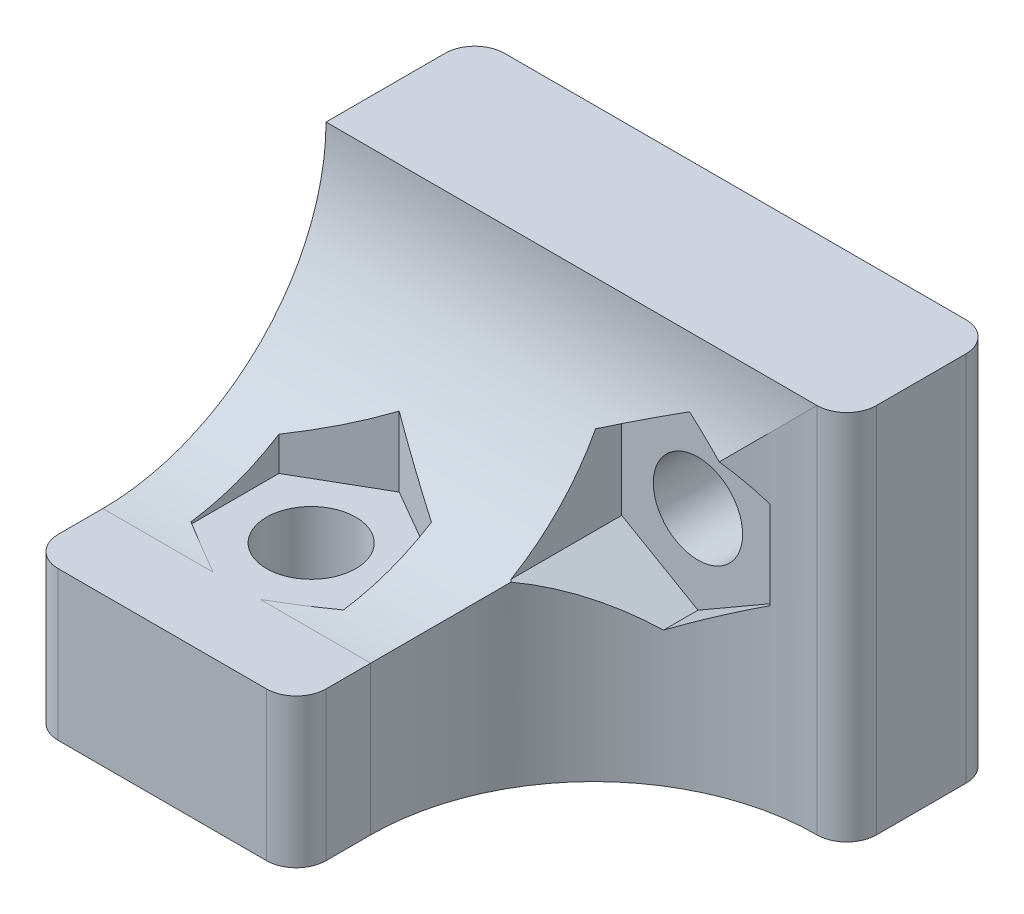
ISO-10303-21;
HEADER;
FILE_DESCRIPTION(('STEP AP214'),'2;1');
FILE_NAME('part.step','',(''),(''),'','','');
FILE_SCHEMA(('AUTOMOTIVE_DESIGN { 1 0 10303 214 1 1 1 1 }'));
ENDSEC;
DATA;
#1=APPLICATION_CONTEXT('core data for automotive mechanical design processes');
#2=APPLICATION_PROTOCOL_DEFINITION('international standard','automotive_design',2000,#1);
#3=PRODUCT_CONTEXT('',#1,'mechanical');
#4=PRODUCT('Part','Part','',(#3));
#5=PRODUCT_RELATED_PRODUCT_CATEGORY('part','',(#4));
#6=PRODUCT_DEFINITION_FORMATION('','',#4);
#7=PRODUCT_DEFINITION_CONTEXT('part definition',#1,'design');
#8=PRODUCT_DEFINITION('design','',#6,#7);
#9=PRODUCT_DEFINITION_SHAPE('','',#8);
#10=(LENGTH_UNIT() NAMED_UNIT(*) SI_UNIT(.MILLI.,.METRE.));
#11=(NAMED_UNIT(*) PLANE_ANGLE_UNIT() SI_UNIT($,.RADIAN.));
#12=(NAMED_UNIT(*) SI_UNIT($,.STERADIAN.) SOLID_ANGLE_UNIT());
#13=UNCERTAINTY_MEASURE_WITH_UNIT(LENGTH_MEASURE(1.E-05),#10,'distance_accuracy_value','');
#14=(GEOMETRIC_REPRESENTATION_CONTEXT(3) GLOBAL_UNCERTAINTY_ASSIGNED_CONTEXT((#13)) GLOBAL_UNIT_ASSIGNED_CONTEXT((#10,
#11,#12)) REPRESENTATION_CONTEXT('',''));
#15=CARTESIAN_POINT('',(0.,0.,0.));
#16=DIRECTION('',(0.,0.,1.));
#17=DIRECTION('',(1.,0.,0.));
#18=AXIS2_PLACEMENT_3D('',#15,#16,#17);
#19=CARTESIAN_POINT('',(17.5,12.5,10.));
#20=DIRECTION('',(-1.,0.,0.));
#21=DIRECTION('',(0.,0.,1.));
#22=AXIS2_PLACEMENT_3D('',#19,#20,#21);
#23=PLANE('',#22);
#24=DIRECTION('',(0.,0.,-1.));
#25=VECTOR('',#24,1.);
#26=CARTESIAN_POINT('',(17.5,12.5,10.));
#27=LINE('',#26,#25);
#28=CARTESIAN_POINT('',(17.5,12.5,8.));
#29=VERTEX_POINT('',#28);
#30=CARTESIAN_POINT('',(17.5,12.5,2.));
#31=VERTEX_POINT('',#30);
#32=EDGE_CURVE('E369',#29,#31,#27,.T.);
#33=ORIENTED_EDGE('',*,*,#32,.F.);
#34=DIRECTION('',(0.,1.,0.));
#35=VECTOR('',#34,1.);
#36=CARTESIAN_POINT('',(17.5,-12.5,8.));
#37=LINE('',#36,#35);
#38=CARTESIAN_POINT('',(17.5,-12.5,8.));
#39=VERTEX_POINT('',#38);
#40=EDGE_CURVE('E410',#29,#39,#37,.F.);
#41=ORIENTED_EDGE('',*,*,#40,.T.);
#42=DIRECTION('',(0.,0.,-1.));
#43=VECTOR('',#42,1.);
#44=CARTESIAN_POINT('',(17.5,-12.5,10.));
#45=LINE('',#44,#43);
#46=CARTESIAN_POINT('',(17.5,-12.5,2.));
#47=VERTEX_POINT('',#46);
#48=EDGE_CURVE('E350',#39,#47,#45,.T.);
#49=ORIENTED_EDGE('',*,*,#48,.T.);
#50=DIRECTION('',(0.,1.,0.));
#51=VECTOR('',#50,1.);
#52=CARTESIAN_POINT('',(17.5,12.5,2.));
#53=LINE('',#52,#51);
#54=EDGE_CURVE('E406',#47,#31,#53,.T.);
#55=ORIENTED_EDGE('',*,*,#54,.T.);
#56=EDGE_LOOP('',(#33,#41,#49,#55));
#57=FACE_BOUND('',#56,.T.);
#58=ADVANCED_FACE('F45',(#57),#23,.F.);
#59=CARTESIAN_POINT('',(-17.5,12.5,10.));
#60=DIRECTION('',(0.,-1.,0.));
#61=DIRECTION('',(0.,0.,-1.));
#62=AXIS2_PLACEMENT_3D('',#59,#60,#61);
#63=PLANE('',#62);
#64=DIRECTION('',(-1.,0.,0.));
#65=VECTOR('',#64,1.);
#66=CARTESIAN_POINT('',(-17.5,12.5,10.));
#67=LINE('',#66,#65);
#68=CARTESIAN_POINT('',(15.5,12.5,10.));
#69=VERTEX_POINT('',#68);
#70=CARTESIAN_POINT('',(-17.5,12.5,10.));
#71=VERTEX_POINT('',#70);
#72=EDGE_CURVE('E346',#69,#71,#67,.T.);
#73=ORIENTED_EDGE('',*,*,#72,.F.);
#74=CARTESIAN_POINT('',(15.5,12.5,8.));
#75=DIRECTION('',(0.,-1.,0.));
#76=DIRECTION('',(0.,0.,-1.));
#77=AXIS2_PLACEMENT_3D('',#74,#75,#76);
#78=CIRCLE('',#77,2.);
#79=EDGE_CURVE('E403',#69,#29,#78,.F.);
#80=ORIENTED_EDGE('',*,*,#79,.T.);
#81=ORIENTED_EDGE('',*,*,#32,.T.);
#82=CARTESIAN_POINT('',(15.5,12.5,2.));
#83=DIRECTION('',(0.,-1.,0.));
#84=DIRECTION('',(0.,0.,-1.));
#85=AXIS2_PLACEMENT_3D('',#82,#83,#84);
#86=CIRCLE('',#85,2.);
#87=CARTESIAN_POINT('',(15.5,12.5,0.));
#88=VERTEX_POINT('',#87);
#89=EDGE_CURVE('E400',#31,#88,#86,.F.);
#90=ORIENTED_EDGE('',*,*,#89,.T.);
#91=DIRECTION('',(-1.,0.,0.));
#92=VECTOR('',#91,1.);
#93=CARTESIAN_POINT('',(-17.5,12.5,0.));
#94=LINE('',#93,#92);
#95=CARTESIAN_POINT('',(-15.5,12.5,0.));
#96=VERTEX_POINT('',#95);
#97=EDGE_CURVE('E345',#88,#96,#94,.T.);
#98=ORIENTED_EDGE('',*,*,#97,.T.);
#99=CARTESIAN_POINT('',(-15.5,12.5,2.));
#100=DIRECTION('',(0.,-1.,0.));
#101=DIRECTION('',(0.,0.,-1.));
#102=AXIS2_PLACEMENT_3D('',#99,#100,#101);
#103=CIRCLE('',#102,2.);
#104=CARTESIAN_POINT('',(-17.5,12.5,2.));
#105=VERTEX_POINT('',#104);
#106=EDGE_CURVE('E393',#96,#105,#103,.F.);
#107=ORIENTED_EDGE('',*,*,#106,.T.);
#108=DIRECTION('',(0.,0.,-1.));
#109=VECTOR('',#108,1.);
#110=CARTESIAN_POINT('',(-17.5,12.5,10.));
#111=LINE('',#110,#109);
#112=EDGE_CURVE('E365',#71,#105,#111,.T.);
#113=ORIENTED_EDGE('',*,*,#112,.F.);
#114=EDGE_LOOP('',(#73,#80,#81,#90,#98,#107,#113));
#115=FACE_BOUND('',#114,.T.);
#116=ADVANCED_FACE('F537',(#115),#63,.F.);
#117=CARTESIAN_POINT('',(-17.5,12.5,10.));
#118=DIRECTION('',(1.,0.,0.));
#119=DIRECTION('',(0.,1.,0.));
#120=AXIS2_PLACEMENT_3D('',#117,#118,#119);
#121=PLANE('',#120);
#122=ORIENTED_EDGE('',*,*,#112,.T.);
#123=DIRECTION('',(0.,-1.,0.));
#124=VECTOR('',#123,1.);
#125=CARTESIAN_POINT('',(-17.5,12.5,2.));
#126=LINE('',#125,#124);
#127=CARTESIAN_POINT('',(-17.5,-12.5,2.));
#128=VERTEX_POINT('',#127);
#129=EDGE_CURVE('E437',#105,#128,#126,.T.);
#130=ORIENTED_EDGE('',*,*,#129,.T.);
#131=DIRECTION('',(0.,0.,-1.));
#132=VECTOR('',#131,1.);
#133=CARTESIAN_POINT('',(-17.5,-12.5,10.));
#134=LINE('',#133,#132);
#135=CARTESIAN_POINT('',(-17.5,-12.5,28.));
#136=VERTEX_POINT('',#135);
#137=EDGE_CURVE('E361',#136,#128,#134,.T.);
#138=ORIENTED_EDGE('',*,*,#137,.F.);
#139=DIRECTION('',(0.,-1.,0.));
#140=VECTOR('',#139,1.);
#141=CARTESIAN_POINT('',(-17.5,-2.5,28.));
#142=LINE('',#141,#140);
#143=CARTESIAN_POINT('',(-17.5,-2.5,28.));
#144=VERTEX_POINT('',#143);
#145=EDGE_CURVE('E434',#136,#144,#142,.F.);
#146=ORIENTED_EDGE('',*,*,#145,.T.);
#147=DIRECTION('',(0.,0.,-1.));
#148=VECTOR('',#147,1.);
#149=CARTESIAN_POINT('',(-17.5,-2.5,30.));
#150=LINE('',#149,#148);
#151=CARTESIAN_POINT('',(-17.5,-2.5,25.));
#152=VERTEX_POINT('',#151);
#153=EDGE_CURVE('E333',#144,#152,#150,.T.);
#154=ORIENTED_EDGE('',*,*,#153,.T.);
#155=CARTESIAN_POINT('',(-17.5,12.5,25.));
#156=DIRECTION('',(1.,0.,0.));
#157=DIRECTION('',(0.,1.,0.));
#158=AXIS2_PLACEMENT_3D('',#155,#156,#157);
#159=CIRCLE('',#158,15.);
#160=EDGE_CURVE('E390',#152,#71,#159,.T.);
#161=ORIENTED_EDGE('',*,*,#160,.T.);
#162=EDGE_LOOP('',(#122,#130,#138,#146,#154,#161));
#163=FACE_BOUND('',#162,.T.);
#164=ADVANCED_FACE('F577',(#163),#121,.F.);
#165=CARTESIAN_POINT('',(-17.5,-12.5,10.));
#166=DIRECTION('',(0.,1.,0.));
#167=DIRECTION('',(0.,0.,1.));
#168=AXIS2_PLACEMENT_3D('',#165,#166,#167);
#169=PLANE('',#168);
#170=CARTESIAN_POINT('',(-8.49999999999999,-12.5,20.));
#171=DIRECTION('',(0.,1.,0.));
#172=DIRECTION('',(-1.,0.,0.));
#173=AXIS2_PLACEMENT_3D('',#170,#171,#172);
#174=CIRCLE('',#173,3.);
#175=CARTESIAN_POINT('',(-11.5,-12.5,20.));
#176=VERTEX_POINT('',#175);
#177=EDGE_CURVE('E317',#176,#176,#174,.T.);
#178=ORIENTED_EDGE('',*,*,#177,.T.);
#179=EDGE_LOOP('',(#178));
#180=FACE_BOUND('',#179,.T.);
#181=ORIENTED_EDGE('',*,*,#48,.F.);
#182=CARTESIAN_POINT('',(15.5,-12.5,8.));
#183=DIRECTION('',(0.,1.,0.));
#184=DIRECTION('',(0.,0.,1.));
#185=AXIS2_PLACEMENT_3D('',#182,#183,#184);
#186=CIRCLE('',#185,2.);
#187=CARTESIAN_POINT('',(15.5,-12.5,10.));
#188=VERTEX_POINT('',#187);
#189=EDGE_CURVE('E425',#39,#188,#186,.F.);
#190=ORIENTED_EDGE('',*,*,#189,.T.);
#191=CARTESIAN_POINT('',(15.5,-12.5,25.));
#192=DIRECTION('',(0.,1.,0.));
#193=DIRECTION('',(0.,0.,1.));
#194=AXIS2_PLACEMENT_3D('',#191,#192,#193);
#195=CIRCLE('',#194,15.);
#196=CARTESIAN_POINT('',(0.5,-12.5,25.));
#197=VERTEX_POINT('',#196);
#198=EDGE_CURVE('E386',#188,#197,#195,.T.);
#199=ORIENTED_EDGE('',*,*,#198,.T.);
#200=DIRECTION('',(0.,0.,-1.));
#201=VECTOR('',#200,1.);
#202=CARTESIAN_POINT('',(0.5,-12.5,30.));
#203=LINE('',#202,#201);
#204=CARTESIAN_POINT('',(0.5,-12.5,28.));
#205=VERTEX_POINT('',#204);
#206=EDGE_CURVE('E330',#205,#197,#203,.T.);
#207=ORIENTED_EDGE('',*,*,#206,.F.);
#208=CARTESIAN_POINT('',(-1.5,-12.5,28.));
#209=DIRECTION('',(0.,1.,0.));
#210=DIRECTION('',(0.,0.,1.));
#211=AXIS2_PLACEMENT_3D('',#208,#209,#210);
#212=CIRCLE('',#211,2.);
#213=CARTESIAN_POINT('',(-1.5,-12.5,30.));
#214=VERTEX_POINT('',#213);
#215=EDGE_CURVE('E413',#205,#214,#212,.F.);
#216=ORIENTED_EDGE('',*,*,#215,.T.);
#217=DIRECTION('',(1.,0.,0.));
#218=VECTOR('',#217,1.);
#219=CARTESIAN_POINT('',(0.5,-12.5,30.));
#220=LINE('',#219,#218);
#221=CARTESIAN_POINT('',(-15.5,-12.5,30.));
#222=VERTEX_POINT('',#221);
#223=EDGE_CURVE('E326',#222,#214,#220,.T.);
#224=ORIENTED_EDGE('',*,*,#223,.F.);
#225=CARTESIAN_POINT('',(-15.5,-12.5,28.));
#226=DIRECTION('',(0.,1.,0.));
#227=DIRECTION('',(0.,0.,1.));
#228=AXIS2_PLACEMENT_3D('',#225,#226,#227);
#229=CIRCLE('',#228,2.);
#230=EDGE_CURVE('E416',#222,#136,#229,.F.);
#231=ORIENTED_EDGE('',*,*,#230,.T.);
#232=ORIENTED_EDGE('',*,*,#137,.T.);
#233=CARTESIAN_POINT('',(-15.5,-12.5,2.));
#234=DIRECTION('',(0.,1.,0.));
#235=DIRECTION('',(0.,0.,1.));
#236=AXIS2_PLACEMENT_3D('',#233,#234,#235);
#237=CIRCLE('',#236,2.);
#238=CARTESIAN_POINT('',(-15.5,-12.5,0.));
#239=VERTEX_POINT('',#238);
#240=EDGE_CURVE('E419',#128,#239,#237,.F.);
#241=ORIENTED_EDGE('',*,*,#240,.T.);
#242=DIRECTION('',(1.,0.,0.));
#243=VECTOR('',#242,1.);
#244=CARTESIAN_POINT('',(-17.5,-12.5,0.));
#245=LINE('',#244,#243);
#246=CARTESIAN_POINT('',(15.5,-12.5,0.));
#247=VERTEX_POINT('',#246);
#248=EDGE_CURVE('E351',#239,#247,#245,.T.);
#249=ORIENTED_EDGE('',*,*,#248,.T.);
#250=CARTESIAN_POINT('',(15.5,-12.5,2.));
#251=DIRECTION('',(0.,1.,0.));
#252=DIRECTION('',(0.,0.,1.));
#253=AXIS2_PLACEMENT_3D('',#250,#251,#252);
#254=CIRCLE('',#253,2.);
#255=EDGE_CURVE('E422',#247,#47,#254,.F.);
#256=ORIENTED_EDGE('',*,*,#255,.T.);
#257=EDGE_LOOP('',(#181,#190,#199,#207,#216,#224,#231,#232,#241,#249,#256));
#258=FACE_BOUND('',#257,.T.);
#259=ADVANCED_FACE('F526',(#180,#258),#169,.F.);
#260=CARTESIAN_POINT('',(0.,0.,0.));
#261=DIRECTION('',(0.,0.,1.));
#262=DIRECTION('',(1.,0.,0.));
#263=AXIS2_PLACEMENT_3D('',#260,#261,#262);
#264=PLANE('',#263);
#265=CARTESIAN_POINT('',(7.5,2.5,0.));
#266=DIRECTION('',(0.,0.,1.));
#267=DIRECTION('',(1.,0.,0.));
#268=AXIS2_PLACEMENT_3D('',#265,#266,#267);
#269=CIRCLE('',#268,3.);
#270=CARTESIAN_POINT('',(10.5,2.5,0.));
#271=VERTEX_POINT('',#270);
#272=EDGE_CURVE('E341',#271,#271,#269,.T.);
#273=ORIENTED_EDGE('',*,*,#272,.T.);
#274=EDGE_LOOP('',(#273));
#275=FACE_BOUND('',#274,.T.);
#276=ORIENTED_EDGE('',*,*,#97,.F.);
#277=DIRECTION('',(0.,1.,0.));
#278=VECTOR('',#277,1.);
#279=CARTESIAN_POINT('',(15.5,0.,0.));
#280=LINE('',#279,#278);
#281=EDGE_CURVE('E431',#88,#247,#280,.F.);
#282=ORIENTED_EDGE('',*,*,#281,.T.);
#283=ORIENTED_EDGE('',*,*,#248,.F.);
#284=DIRECTION('',(0.,-1.,0.));
#285=VECTOR('',#284,1.);
#286=CARTESIAN_POINT('',(-15.5,0.,0.));
#287=LINE('',#286,#285);
#288=EDGE_CURVE('E428',#239,#96,#287,.F.);
#289=ORIENTED_EDGE('',*,*,#288,.T.);
#290=EDGE_LOOP('',(#276,#282,#283,#289));
#291=FACE_BOUND('',#290,.T.);
#292=ADVANCED_FACE('F618',(#275,#291),#264,.F.);
#293=CARTESIAN_POINT('',(7.5,2.5,0.));
#294=DIRECTION('',(0.,0.,1.));
#295=DIRECTION('',(1.,0.,0.));
#296=AXIS2_PLACEMENT_3D('',#293,#294,#295);
#297=CYLINDRICAL_SURFACE('',#296,3.);
#298=CARTESIAN_POINT('',(7.5,2.5,10.));
#299=DIRECTION('',(0.,0.,-1.));
#300=DIRECTION('',(-1.,0.,0.));
#301=AXIS2_PLACEMENT_3D('',#298,#299,#300);
#302=CIRCLE('',#301,3.);
#303=CARTESIAN_POINT('',(4.5,2.5,10.));
#304=VERTEX_POINT('',#303);
#305=EDGE_CURVE('E316',#304,#304,#302,.F.);
#306=ORIENTED_EDGE('',*,*,#305,.T.);
#307=EDGE_LOOP('',(#306));
#308=FACE_BOUND('',#307,.T.);
#309=ORIENTED_EDGE('',*,*,#272,.F.);
#310=EDGE_LOOP('',(#309));
#311=FACE_BOUND('',#310,.T.);
#312=ADVANCED_FACE('F622',(#308,#311),#297,.F.);
#313=CARTESIAN_POINT('',(0.5,-12.5,30.));
#314=DIRECTION('',(-1.,0.,0.));
#315=DIRECTION('',(0.,0.,1.));
#316=AXIS2_PLACEMENT_3D('',#313,#314,#315);
#317=PLANE('',#316);
#318=DIRECTION('',(0.,0.,-1.));
#319=VECTOR('',#318,1.);
#320=CARTESIAN_POINT('',(0.5,-2.5,30.));
#321=LINE('',#320,#319);
#322=CARTESIAN_POINT('',(0.5,-2.5,28.));
#323=VERTEX_POINT('',#322);
#324=CARTESIAN_POINT('',(0.5,-2.5,25.));
#325=VERTEX_POINT('',#324);
#326=EDGE_CURVE('E337',#323,#325,#321,.T.);
#327=ORIENTED_EDGE('',*,*,#326,.F.);
#328=DIRECTION('',(0.,1.,0.));
#329=VECTOR('',#328,1.);
#330=CARTESIAN_POINT('',(0.5,-12.5,28.));
#331=LINE('',#330,#329);
#332=EDGE_CURVE('E455',#323,#205,#331,.F.);
#333=ORIENTED_EDGE('',*,*,#332,.T.);
#334=ORIENTED_EDGE('',*,*,#206,.T.);
#335=DIRECTION('',(0.,1.,0.));
#336=VECTOR('',#335,1.);
#337=CARTESIAN_POINT('',(0.5,-12.5,25.));
#338=LINE('',#337,#336);
#339=EDGE_CURVE('E373',#197,#325,#338,.T.);
#340=ORIENTED_EDGE('',*,*,#339,.T.);
#341=EDGE_LOOP('',(#327,#333,#334,#340));
#342=FACE_BOUND('',#341,.T.);
#343=ADVANCED_FACE('F521',(#342),#317,.F.);
#344=CARTESIAN_POINT('',(0.5,-2.5,30.));
#345=DIRECTION('',(0.,-1.,0.));
#346=DIRECTION('',(1.,0.,0.));
#347=AXIS2_PLACEMENT_3D('',#344,#345,#346);
#348=PLANE('',#347);
#349=DIRECTION('',(-0.866025403784438,0.,-0.5));
#350=VECTOR('',#349,1.);
#351=CARTESIAN_POINT('',(-8.49999999999999,-2.5,25.9178402591937));
#352=LINE('',#351,#350);
#353=CARTESIAN_POINT('',(-10.0897459621557,-2.5,25.));
#354=VERTEX_POINT('',#353);
#355=CARTESIAN_POINT('',(-13.625,-2.5,22.9589201295969));
#356=VERTEX_POINT('',#355);
#357=EDGE_CURVE('E61',#354,#356,#352,.T.);
#358=ORIENTED_EDGE('',*,*,#357,.F.);
#359=DIRECTION('',(-1.,0.,0.));
#360=VECTOR('',#359,1.);
#361=CARTESIAN_POINT('',(0.5,-2.5,25.));
#362=LINE('',#361,#360);
#363=EDGE_CURVE('E381',#354,#152,#362,.T.);
#364=ORIENTED_EDGE('',*,*,#363,.T.);
#365=ORIENTED_EDGE('',*,*,#153,.F.);
#366=CARTESIAN_POINT('',(-15.5,-2.5,28.));
#367=DIRECTION('',(0.,-1.,0.));
#368=DIRECTION('',(1.,0.,0.));
#369=AXIS2_PLACEMENT_3D('',#366,#367,#368);
#370=CIRCLE('',#369,2.);
#371=CARTESIAN_POINT('',(-15.5,-2.5,30.));
#372=VERTEX_POINT('',#371);
#373=EDGE_CURVE('E452',#144,#372,#370,.F.);
#374=ORIENTED_EDGE('',*,*,#373,.T.);
#375=DIRECTION('',(-1.,0.,0.));
#376=VECTOR('',#375,1.);
#377=CARTESIAN_POINT('',(0.5,-2.5,30.));
#378=LINE('',#377,#376);
#379=CARTESIAN_POINT('',(-1.5,-2.5,30.));
#380=VERTEX_POINT('',#379);
#381=EDGE_CURVE('E321',#380,#372,#378,.T.);
#382=ORIENTED_EDGE('',*,*,#381,.F.);
#383=CARTESIAN_POINT('',(-1.5,-2.5,28.));
#384=DIRECTION('',(0.,-1.,0.));
#385=DIRECTION('',(1.,0.,0.));
#386=AXIS2_PLACEMENT_3D('',#383,#384,#385);
#387=CIRCLE('',#386,2.);
#388=EDGE_CURVE('E449',#380,#323,#387,.F.);
#389=ORIENTED_EDGE('',*,*,#388,.T.);
#390=ORIENTED_EDGE('',*,*,#326,.T.);
#391=CARTESIAN_POINT('',(-6.91025403784429,-2.5,25.));
#392=VERTEX_POINT('',#391);
#393=EDGE_CURVE('E382',#325,#392,#362,.T.);
#394=ORIENTED_EDGE('',*,*,#393,.T.);
#395=DIRECTION('',(-0.866025403784438,0.,0.5));
#396=VECTOR('',#395,1.);
#397=CARTESIAN_POINT('',(-3.37499999999995,-2.5,22.9589201295969));
#398=LINE('',#397,#396);
#399=CARTESIAN_POINT('',(-3.37499999999995,-2.5,22.9589201295969));
#400=VERTEX_POINT('',#399);
#401=EDGE_CURVE('E247',#400,#392,#398,.T.);
#402=ORIENTED_EDGE('',*,*,#401,.F.);
#403=DIRECTION('',(0.,0.,1.));
#404=VECTOR('',#403,1.);
#405=CARTESIAN_POINT('',(-3.37499999999995,-2.5,17.0410798704031));
#406=LINE('',#405,#404);
#407=CARTESIAN_POINT('',(-3.37499999999995,-2.5,17.0410798704031));
#408=VERTEX_POINT('',#407);
#409=EDGE_CURVE('E236',#408,#400,#406,.T.);
#410=ORIENTED_EDGE('',*,*,#409,.F.);
#411=DIRECTION('',(0.866025403784438,0.,0.5));
#412=VECTOR('',#411,1.);
#413=CARTESIAN_POINT('',(-8.5,-2.5,14.0821597408063));
#414=LINE('',#413,#412);
#415=CARTESIAN_POINT('',(-8.5,-2.5,14.0821597408063));
#416=VERTEX_POINT('',#415);
#417=EDGE_CURVE('E218',#416,#408,#414,.T.);
#418=ORIENTED_EDGE('',*,*,#417,.F.);
#419=DIRECTION('',(0.866025403784438,0.,-0.5));
#420=VECTOR('',#419,1.);
#421=CARTESIAN_POINT('',(-13.625,-2.5,17.0410798704031));
#422=LINE('',#421,#420);
#423=CARTESIAN_POINT('',(-13.625,-2.5,17.0410798704031));
#424=VERTEX_POINT('',#423);
#425=EDGE_CURVE('E232',#424,#416,#422,.T.);
#426=ORIENTED_EDGE('',*,*,#425,.F.);
#427=DIRECTION('',(0.,0.,-1.));
#428=VECTOR('',#427,1.);
#429=CARTESIAN_POINT('',(-13.625,-2.5,22.9589201295969));
#430=LINE('',#429,#428);
#431=EDGE_CURVE('E226',#356,#424,#430,.T.);
#432=ORIENTED_EDGE('',*,*,#431,.F.);
#433=EDGE_LOOP('',(#358,#364,#365,#374,#382,#389,#390,#394,#402,#410,#418,#426,#432));
#434=FACE_BOUND('',#433,.T.);
#435=CARTESIAN_POINT('',(-8.5,-2.5,20.));
#436=DIRECTION('',(0.,-1.,0.));
#437=DIRECTION('',(0.,0.,-1.));
#438=AXIS2_PLACEMENT_3D('',#435,#436,#437);
#439=CIRCLE('',#438,3.);
#440=CARTESIAN_POINT('',(-8.5,-2.5,17.));
#441=VERTEX_POINT('',#440);
#442=EDGE_CURVE('E256',#441,#441,#439,.F.);
#443=ORIENTED_EDGE('',*,*,#442,.F.);
#444=EDGE_LOOP('',(#443));
#445=FACE_BOUND('',#444,.T.);
#446=ADVANCED_FACE('F230',(#434,#445),#348,.F.);
#447=CARTESIAN_POINT('',(0.,0.,30.));
#448=DIRECTION('',(0.,0.,1.));
#449=DIRECTION('',(1.,0.,0.));
#450=AXIS2_PLACEMENT_3D('',#447,#448,#449);
#451=PLANE('',#450);
#452=ORIENTED_EDGE('',*,*,#381,.T.);
#453=DIRECTION('',(0.,-1.,0.));
#454=VECTOR('',#453,1.);
#455=CARTESIAN_POINT('',(-15.5,-12.5,30.));
#456=LINE('',#455,#454);
#457=EDGE_CURVE('E445',#372,#222,#456,.T.);
#458=ORIENTED_EDGE('',*,*,#457,.T.);
#459=ORIENTED_EDGE('',*,*,#223,.T.);
#460=DIRECTION('',(0.,1.,0.));
#461=VECTOR('',#460,1.);
#462=CARTESIAN_POINT('',(-1.5,-2.5,30.));
#463=LINE('',#462,#461);
#464=EDGE_CURVE('E441',#214,#380,#463,.T.);
#465=ORIENTED_EDGE('',*,*,#464,.T.);
#466=EDGE_LOOP('',(#452,#458,#459,#465));
#467=FACE_BOUND('',#466,.T.);
#468=ADVANCED_FACE('F606',(#467),#451,.T.);
#469=CARTESIAN_POINT('',(-8.49999999999999,-12.5,20.));
#470=DIRECTION('',(0.,1.,0.));
#471=DIRECTION('',(-1.,0.,0.));
#472=AXIS2_PLACEMENT_3D('',#469,#470,#471);
#473=CYLINDRICAL_SURFACE('',#472,3.);
#474=ORIENTED_EDGE('',*,*,#442,.T.);
#475=EDGE_LOOP('',(#474));
#476=FACE_BOUND('',#475,.T.);
#477=ORIENTED_EDGE('',*,*,#177,.F.);
#478=EDGE_LOOP('',(#477));
#479=FACE_BOUND('',#478,.T.);
#480=ADVANCED_FACE('F585',(#476,#479),#473,.F.);
#481=CARTESIAN_POINT('',(0.499999999999999,12.5,25.));
#482=DIRECTION('',(-1.,0.,0.));
#483=DIRECTION('',(0.,-1.,0.));
#484=AXIS2_PLACEMENT_3D('',#481,#482,#483);
#485=CYLINDRICAL_SURFACE('',#484,15.);
#486=ORIENTED_EDGE('',*,*,#363,.F.);
#487=CARTESIAN_POINT('',(-10.0897459621557,12.5,25.));
#488=DIRECTION('',(-0.5,0.,0.866025403784438));
#489=DIRECTION('',(-0.866025403784439,0.,-0.5));
#490=AXIS2_PLACEMENT_3D('',#487,#488,#489);
#491=ELLIPSE('',#490,30.,15.);
#492=CARTESIAN_POINT('',(-13.625,-2.36048427752727,22.9589201295969));
#493=VERTEX_POINT('',#492);
#494=EDGE_CURVE('E11',#354,#493,#491,.F.);
#495=ORIENTED_EDGE('',*,*,#494,.T.);
#496=CARTESIAN_POINT('',(-13.625,12.5,25.));
#497=DIRECTION('',(-1.,0.,0.));
#498=DIRECTION('',(0.,0.,1.));
#499=AXIS2_PLACEMENT_3D('',#496,#497,#498);
#500=CIRCLE('',#499,15.);
#501=CARTESIAN_POINT('',(-13.625,-0.214385174702625,17.0410798704031));
#502=VERTEX_POINT('',#501);
#503=EDGE_CURVE('E54',#493,#502,#500,.F.);
#504=ORIENTED_EDGE('',*,*,#503,.T.);
#505=CARTESIAN_POINT('',(-27.4102540378445,12.5,25.));
#506=DIRECTION('',(-0.5,0.,-0.866025403784438));
#507=DIRECTION('',(-0.866025403784439,0.,0.5));
#508=AXIS2_PLACEMENT_3D('',#505,#506,#507);
#509=ELLIPSE('',#508,30.,15.);
#510=CARTESIAN_POINT('',(-8.5,2.21405016176295,14.0821597408063));
#511=VERTEX_POINT('',#510);
#512=EDGE_CURVE('E495',#502,#511,#509,.F.);
#513=ORIENTED_EDGE('',*,*,#512,.T.);
#514=CARTESIAN_POINT('',(10.4102540378445,12.5,25.));
#515=DIRECTION('',(0.5,0.,-0.866025403784439));
#516=DIRECTION('',(-0.866025403784439,0.,-0.5));
#517=AXIS2_PLACEMENT_3D('',#514,#515,#516);
#518=ELLIPSE('',#517,30.,15.);
#519=CARTESIAN_POINT('',(-3.37499999999995,-0.214385174702625,17.0410798704031));
#520=VERTEX_POINT('',#519);
#521=EDGE_CURVE('E220',#511,#520,#518,.F.);
#522=ORIENTED_EDGE('',*,*,#521,.T.);
#523=CARTESIAN_POINT('',(-3.37499999999995,12.5,25.));
#524=DIRECTION('',(1.,0.,0.));
#525=DIRECTION('',(0.,0.,-1.));
#526=AXIS2_PLACEMENT_3D('',#523,#524,#525);
#527=CIRCLE('',#526,15.);
#528=CARTESIAN_POINT('',(-3.37499999999995,-2.36048427752726,22.9589201295969));
#529=VERTEX_POINT('',#528);
#530=EDGE_CURVE('E487',#520,#529,#527,.F.);
#531=ORIENTED_EDGE('',*,*,#530,.T.);
#532=CARTESIAN_POINT('',(-6.91025403784429,12.5,25.));
#533=DIRECTION('',(0.5,0.,0.866025403784439));
#534=DIRECTION('',(-0.866025403784439,0.,0.5));
#535=AXIS2_PLACEMENT_3D('',#532,#533,#534);
#536=ELLIPSE('',#535,30.,15.);
#537=EDGE_CURVE('E491',#529,#392,#536,.F.);
#538=ORIENTED_EDGE('',*,*,#537,.T.);
#539=ORIENTED_EDGE('',*,*,#393,.F.);
#540=CARTESIAN_POINT('',(15.5,12.5,25.));
#541=DIRECTION('',(-0.707106781186548,0.707106781186547,0.));
#542=DIRECTION('',(-0.707106781186547,-0.707106781186548,0.));
#543=AXIS2_PLACEMENT_3D('',#540,#541,#542);
#544=ELLIPSE('',#543,21.2132034355964,15.);
#545=CARTESIAN_POINT('',(2.48029041877835,-0.519709581221653,17.5510294388657));
#546=VERTEX_POINT('',#545);
#547=EDGE_CURVE('E397',#546,#325,#544,.T.);
#548=ORIENTED_EDGE('',*,*,#547,.F.);
#549=CARTESIAN_POINT('',(-20.0705080756889,12.5,25.));
#550=DIRECTION('',(-0.5,-0.866025403784439,0.));
#551=DIRECTION('',(-0.866025403784439,0.5,0.));
#552=AXIS2_PLACEMENT_3D('',#549,#550,#551);
#553=ELLIPSE('',#552,30.,15.);
#554=CARTESIAN_POINT('',(2.37499999999996,-0.458920129596859,17.4457701203412));
#555=VERTEX_POINT('',#554);
#556=EDGE_CURVE('E312',#546,#555,#553,.F.);
#557=ORIENTED_EDGE('',*,*,#556,.T.);
#558=CARTESIAN_POINT('',(2.37499999999996,12.5,25.));
#559=DIRECTION('',(-1.,0.,0.));
#560=DIRECTION('',(0.,-1.,0.));
#561=AXIS2_PLACEMENT_3D('',#558,#559,#560);
#562=CIRCLE('',#561,15.);
#563=CARTESIAN_POINT('',(2.37499999999996,5.45892012959686,11.7552578636425));
#564=VERTEX_POINT('',#563);
#565=EDGE_CURVE('E478',#555,#564,#562,.F.);
#566=ORIENTED_EDGE('',*,*,#565,.T.);
#567=CARTESIAN_POINT('',(14.5705080756887,12.5,25.));
#568=DIRECTION('',(-0.5,0.866025403784439,0.));
#569=DIRECTION('',(-0.866025403784439,-0.5,0.));
#570=AXIS2_PLACEMENT_3D('',#567,#568,#569);
#571=ELLIPSE('',#570,30.,15.);
#572=CARTESIAN_POINT('',(7.5,8.41784025919371,10.5661518696316));
#573=VERTEX_POINT('',#572);
#574=EDGE_CURVE('E474',#564,#573,#571,.F.);
#575=ORIENTED_EDGE('',*,*,#574,.T.);
#576=CARTESIAN_POINT('',(0.429491924311322,12.5,25.));
#577=DIRECTION('',(0.5,0.866025403784438,0.));
#578=DIRECTION('',(-0.866025403784439,0.5,0.));
#579=AXIS2_PLACEMENT_3D('',#576,#577,#578);
#580=ELLIPSE('',#579,30.,15.);
#581=CARTESIAN_POINT('',(9.98381119635941,6.98381119635941,11.0511053813361));
#582=VERTEX_POINT('',#581);
#583=EDGE_CURVE('E295',#573,#582,#580,.F.);
#584=ORIENTED_EDGE('',*,*,#583,.T.);
#585=EDGE_CURVE('E322',#69,#582,#544,.T.);
#586=ORIENTED_EDGE('',*,*,#585,.F.);
#587=ORIENTED_EDGE('',*,*,#72,.T.);
#588=ORIENTED_EDGE('',*,*,#160,.F.);
#589=EDGE_LOOP('',(#486,#495,#504,#513,#522,#531,#538,#539,#548,#557,#566,#575,#584,#586,#587,#588));
#590=FACE_BOUND('',#589,.T.);
#591=ADVANCED_FACE('F501',(#590),#485,.F.);
#592=CARTESIAN_POINT('',(15.5,-12.5,25.));
#593=DIRECTION('',(0.,1.,0.));
#594=DIRECTION('',(0.,0.,1.));
#595=AXIS2_PLACEMENT_3D('',#592,#593,#594);
#596=CYLINDRICAL_SURFACE('',#595,15.);
#597=CARTESIAN_POINT('',(15.5,1.20096189432329,25.));
#598=DIRECTION('',(0.5,-0.866025403784439,0.));
#599=DIRECTION('',(0.866025403784439,0.5,0.));
#600=AXIS2_PLACEMENT_3D('',#597,#598,#599);
#601=ELLIPSE('',#600,17.3205080756888,15.);
#602=CARTESIAN_POINT('',(12.625,-0.45892012959686,10.2780987980492));
#603=VERTEX_POINT('',#602);
#604=CARTESIAN_POINT('',(7.50000000000001,-3.41784025919372,12.3114224595505));
#605=VERTEX_POINT('',#604);
#606=EDGE_CURVE('E466',#603,#605,#601,.F.);
#607=ORIENTED_EDGE('',*,*,#606,.T.);
#608=CARTESIAN_POINT('',(15.5,-8.03664241271072,25.));
#609=DIRECTION('',(-0.5,-0.866025403784439,0.));
#610=DIRECTION('',(-0.866025403784439,0.5,0.));
#611=AXIS2_PLACEMENT_3D('',#608,#609,#610);
#612=ELLIPSE('',#611,17.3205080756888,15.);
#613=EDGE_CURVE('E470',#605,#546,#612,.F.);
#614=ORIENTED_EDGE('',*,*,#613,.T.);
#615=ORIENTED_EDGE('',*,*,#547,.T.);
#616=ORIENTED_EDGE('',*,*,#339,.F.);
#617=ORIENTED_EDGE('',*,*,#198,.F.);
#618=DIRECTION('',(0.,1.,0.));
#619=VECTOR('',#618,1.);
#620=CARTESIAN_POINT('',(15.5,0.,10.));
#621=LINE('',#620,#619);
#622=EDGE_CURVE('E377',#69,#188,#621,.F.);
#623=ORIENTED_EDGE('',*,*,#622,.F.);
#624=ORIENTED_EDGE('',*,*,#585,.T.);
#625=CARTESIAN_POINT('',(15.5,3.79903810567671,25.));
#626=DIRECTION('',(0.5,0.866025403784438,0.));
#627=DIRECTION('',(-0.866025403784439,0.5,0.));
#628=AXIS2_PLACEMENT_3D('',#625,#626,#627);
#629=ELLIPSE('',#628,17.3205080756888,15.);
#630=CARTESIAN_POINT('',(12.625,5.45892012959685,10.2780987980492));
#631=VERTEX_POINT('',#630);
#632=EDGE_CURVE('E458',#582,#631,#629,.F.);
#633=ORIENTED_EDGE('',*,*,#632,.T.);
#634=DIRECTION('',(0.,1.,0.));
#635=VECTOR('',#634,1.);
#636=CARTESIAN_POINT('',(12.625,-12.5,10.2780987980492));
#637=LINE('',#636,#635);
#638=EDGE_CURVE('E462',#631,#603,#637,.F.);
#639=ORIENTED_EDGE('',*,*,#638,.T.);
#640=EDGE_LOOP('',(#607,#614,#615,#616,#617,#623,#624,#633,#639));
#641=FACE_BOUND('',#640,.T.);
#642=ADVANCED_FACE('F514',(#641),#596,.F.);
#643=CARTESIAN_POINT('',(15.5,0.,8.));
#644=DIRECTION('',(0.,-1.,0.));
#645=DIRECTION('',(0.,0.,-1.));
#646=AXIS2_PLACEMENT_3D('',#643,#644,#645);
#647=CYLINDRICAL_SURFACE('',#646,2.);
#648=ORIENTED_EDGE('',*,*,#189,.F.);
#649=ORIENTED_EDGE('',*,*,#40,.F.);
#650=ORIENTED_EDGE('',*,*,#79,.F.);
#651=ORIENTED_EDGE('',*,*,#622,.T.);
#652=EDGE_LOOP('',(#648,#649,#650,#651));
#653=FACE_BOUND('',#652,.T.);
#654=ADVANCED_FACE('F531',(#653),#647,.T.);
#655=CARTESIAN_POINT('',(15.5,12.5,2.));
#656=DIRECTION('',(0.,1.,0.));
#657=DIRECTION('',(0.,0.,1.));
#658=AXIS2_PLACEMENT_3D('',#655,#656,#657);
#659=CYLINDRICAL_SURFACE('',#658,2.);
#660=ORIENTED_EDGE('',*,*,#255,.F.);
#661=ORIENTED_EDGE('',*,*,#281,.F.);
#662=ORIENTED_EDGE('',*,*,#89,.F.);
#663=ORIENTED_EDGE('',*,*,#54,.F.);
#664=EDGE_LOOP('',(#660,#661,#662,#663));
#665=FACE_BOUND('',#664,.T.);
#666=ADVANCED_FACE('F588',(#665),#659,.T.);
#667=CARTESIAN_POINT('',(-15.5,12.5,2.));
#668=DIRECTION('',(0.,-1.,0.));
#669=DIRECTION('',(1.,0.,0.));
#670=AXIS2_PLACEMENT_3D('',#667,#668,#669);
#671=CYLINDRICAL_SURFACE('',#670,2.);
#672=ORIENTED_EDGE('',*,*,#106,.F.);
#673=ORIENTED_EDGE('',*,*,#288,.F.);
#674=ORIENTED_EDGE('',*,*,#240,.F.);
#675=ORIENTED_EDGE('',*,*,#129,.F.);
#676=EDGE_LOOP('',(#672,#673,#674,#675));
#677=FACE_BOUND('',#676,.T.);
#678=ADVANCED_FACE('F591',(#677),#671,.T.);
#679=CARTESIAN_POINT('',(-15.5,0.,28.));
#680=DIRECTION('',(0.,1.,0.));
#681=DIRECTION('',(-1.,0.,0.));
#682=AXIS2_PLACEMENT_3D('',#679,#680,#681);
#683=CYLINDRICAL_SURFACE('',#682,2.);
#684=ORIENTED_EDGE('',*,*,#373,.F.);
#685=ORIENTED_EDGE('',*,*,#145,.F.);
#686=ORIENTED_EDGE('',*,*,#230,.F.);
#687=ORIENTED_EDGE('',*,*,#457,.F.);
#688=EDGE_LOOP('',(#684,#685,#686,#687));
#689=FACE_BOUND('',#688,.T.);
#690=ADVANCED_FACE('F594',(#689),#683,.T.);
#691=CARTESIAN_POINT('',(-1.5,0.,28.));
#692=DIRECTION('',(0.,-1.,0.));
#693=DIRECTION('',(0.,0.,-1.));
#694=AXIS2_PLACEMENT_3D('',#691,#692,#693);
#695=CYLINDRICAL_SURFACE('',#694,2.);
#696=ORIENTED_EDGE('',*,*,#215,.F.);
#697=ORIENTED_EDGE('',*,*,#332,.F.);
#698=ORIENTED_EDGE('',*,*,#388,.F.);
#699=ORIENTED_EDGE('',*,*,#464,.F.);
#700=EDGE_LOOP('',(#696,#697,#698,#699));
#701=FACE_BOUND('',#700,.T.);
#702=ADVANCED_FACE('F47',(#701),#695,.T.);
#703=CARTESIAN_POINT('',(0.,0.,10.));
#704=DIRECTION('',(0.,0.,-1.));
#705=DIRECTION('',(-1.,0.,0.));
#706=AXIS2_PLACEMENT_3D('',#703,#704,#705);
#707=PLANE('',#706);
#708=DIRECTION('',(0.866025403784439,0.5,0.));
#709=VECTOR('',#708,1.);
#710=CARTESIAN_POINT('',(2.37499999999996,5.45892012959686,10.));
#711=LINE('',#710,#709);
#712=CARTESIAN_POINT('',(2.37499999999996,5.45892012959686,10.));
#713=VERTEX_POINT('',#712);
#714=CARTESIAN_POINT('',(7.5,8.41784025919371,10.));
#715=VERTEX_POINT('',#714);
#716=EDGE_CURVE('E268',#713,#715,#711,.T.);
#717=ORIENTED_EDGE('',*,*,#716,.F.);
#718=DIRECTION('',(0.,1.,0.));
#719=VECTOR('',#718,1.);
#720=CARTESIAN_POINT('',(2.37499999999996,-0.458920129596859,10.));
#721=LINE('',#720,#719);
#722=CARTESIAN_POINT('',(2.37499999999996,-0.458920129596859,10.));
#723=VERTEX_POINT('',#722);
#724=EDGE_CURVE('E287',#723,#713,#721,.T.);
#725=ORIENTED_EDGE('',*,*,#724,.F.);
#726=DIRECTION('',(-0.866025403784439,0.5,0.));
#727=VECTOR('',#726,1.);
#728=CARTESIAN_POINT('',(7.50000000000001,-3.41784025919372,10.));
#729=LINE('',#728,#727);
#730=CARTESIAN_POINT('',(7.50000000000001,-3.41784025919372,10.));
#731=VERTEX_POINT('',#730);
#732=EDGE_CURVE('E283',#731,#723,#729,.T.);
#733=ORIENTED_EDGE('',*,*,#732,.F.);
#734=DIRECTION('',(-0.866025403784438,-0.5,0.));
#735=VECTOR('',#734,1.);
#736=CARTESIAN_POINT('',(12.625,-0.45892012959686,10.));
#737=LINE('',#736,#735);
#738=CARTESIAN_POINT('',(12.625,-0.45892012959686,10.));
#739=VERTEX_POINT('',#738);
#740=EDGE_CURVE('E279',#739,#731,#737,.T.);
#741=ORIENTED_EDGE('',*,*,#740,.F.);
#742=DIRECTION('',(0.,-1.,0.));
#743=VECTOR('',#742,1.);
#744=CARTESIAN_POINT('',(12.625,5.45892012959685,10.));
#745=LINE('',#744,#743);
#746=CARTESIAN_POINT('',(12.625,5.45892012959685,10.));
#747=VERTEX_POINT('',#746);
#748=EDGE_CURVE('E275',#747,#739,#745,.T.);
#749=ORIENTED_EDGE('',*,*,#748,.F.);
#750=DIRECTION('',(0.866025403784438,-0.5,0.));
#751=VECTOR('',#750,1.);
#752=CARTESIAN_POINT('',(7.5,8.41784025919371,10.));
#753=LINE('',#752,#751);
#754=EDGE_CURVE('E272',#715,#747,#753,.T.);
#755=ORIENTED_EDGE('',*,*,#754,.F.);
#756=EDGE_LOOP('',(#717,#725,#733,#741,#749,#755));
#757=FACE_BOUND('',#756,.T.);
#758=ORIENTED_EDGE('',*,*,#305,.F.);
#759=EDGE_LOOP('',(#758));
#760=FACE_BOUND('',#759,.T.);
#761=ADVANCED_FACE('F555',(#757,#760),#707,.F.);
#762=CARTESIAN_POINT('',(2.37499999999996,5.45892012959686,30.));
#763=DIRECTION('',(-0.5,0.866025403784439,0.));
#764=DIRECTION('',(-0.866025403784439,-0.5,0.));
#765=AXIS2_PLACEMENT_3D('',#762,#763,#764);
#766=PLANE('',#765);
#767=DIRECTION('',(0.,0.,-1.));
#768=VECTOR('',#767,1.);
#769=CARTESIAN_POINT('',(2.37499999999996,5.45892012959686,30.));
#770=LINE('',#769,#768);
#771=EDGE_CURVE('E292',#564,#713,#770,.T.);
#772=ORIENTED_EDGE('',*,*,#771,.T.);
#773=ORIENTED_EDGE('',*,*,#716,.T.);
#774=DIRECTION('',(0.,0.,-1.));
#775=VECTOR('',#774,1.);
#776=CARTESIAN_POINT('',(7.5,8.41784025919371,30.));
#777=LINE('',#776,#775);
#778=EDGE_CURVE('E291',#573,#715,#777,.T.);
#779=ORIENTED_EDGE('',*,*,#778,.F.);
#780=ORIENTED_EDGE('',*,*,#574,.F.);
#781=EDGE_LOOP('',(#772,#773,#779,#780));
#782=FACE_BOUND('',#781,.T.);
#783=ADVANCED_FACE('F542',(#782),#766,.F.);
#784=CARTESIAN_POINT('',(2.37499999999996,-0.458920129596859,30.));
#785=DIRECTION('',(-1.,0.,0.));
#786=DIRECTION('',(0.,-1.,0.));
#787=AXIS2_PLACEMENT_3D('',#784,#785,#786);
#788=PLANE('',#787);
#789=DIRECTION('',(0.,0.,-1.));
#790=VECTOR('',#789,1.);
#791=CARTESIAN_POINT('',(2.37499999999996,-0.458920129596859,30.));
#792=LINE('',#791,#790);
#793=EDGE_CURVE('E296',#555,#723,#792,.T.);
#794=ORIENTED_EDGE('',*,*,#793,.T.);
#795=ORIENTED_EDGE('',*,*,#724,.T.);
#796=ORIENTED_EDGE('',*,*,#771,.F.);
#797=ORIENTED_EDGE('',*,*,#565,.F.);
#798=EDGE_LOOP('',(#794,#795,#796,#797));
#799=FACE_BOUND('',#798,.T.);
#800=ADVANCED_FACE('F547',(#799),#788,.F.);
#801=CARTESIAN_POINT('',(7.50000000000001,-3.41784025919372,30.));
#802=DIRECTION('',(-0.5,-0.866025403784439,0.));
#803=DIRECTION('',(0.866025403784439,-0.5,0.));
#804=AXIS2_PLACEMENT_3D('',#801,#802,#803);
#805=PLANE('',#804);
#806=ORIENTED_EDGE('',*,*,#613,.F.);
#807=DIRECTION('',(0.,0.,-1.));
#808=VECTOR('',#807,1.);
#809=CARTESIAN_POINT('',(7.50000000000001,-3.41784025919372,30.));
#810=LINE('',#809,#808);
#811=EDGE_CURVE('E299',#605,#731,#810,.T.);
#812=ORIENTED_EDGE('',*,*,#811,.T.);
#813=ORIENTED_EDGE('',*,*,#732,.T.);
#814=ORIENTED_EDGE('',*,*,#793,.F.);
#815=ORIENTED_EDGE('',*,*,#556,.F.);
#816=EDGE_LOOP('',(#806,#812,#813,#814,#815));
#817=FACE_BOUND('',#816,.T.);
#818=ADVANCED_FACE('F549',(#817),#805,.F.);
#819=CARTESIAN_POINT('',(12.625,-0.45892012959686,30.));
#820=DIRECTION('',(0.5,-0.866025403784439,0.));
#821=DIRECTION('',(0.866025403784439,0.5,0.));
#822=AXIS2_PLACEMENT_3D('',#819,#820,#821);
#823=PLANE('',#822);
#824=DIRECTION('',(0.,0.,-1.));
#825=VECTOR('',#824,1.);
#826=CARTESIAN_POINT('',(12.625,-0.45892012959686,30.));
#827=LINE('',#826,#825);
#828=EDGE_CURVE('E302',#603,#739,#827,.T.);
#829=ORIENTED_EDGE('',*,*,#828,.T.);
#830=ORIENTED_EDGE('',*,*,#740,.T.);
#831=ORIENTED_EDGE('',*,*,#811,.F.);
#832=ORIENTED_EDGE('',*,*,#606,.F.);
#833=EDGE_LOOP('',(#829,#830,#831,#832));
#834=FACE_BOUND('',#833,.T.);
#835=ADVANCED_FACE('F562',(#834),#823,.F.);
#836=CARTESIAN_POINT('',(12.625,5.45892012959685,30.));
#837=DIRECTION('',(1.,0.,0.));
#838=DIRECTION('',(0.,0.,-1.));
#839=AXIS2_PLACEMENT_3D('',#836,#837,#838);
#840=PLANE('',#839);
#841=DIRECTION('',(0.,0.,-1.));
#842=VECTOR('',#841,1.);
#843=CARTESIAN_POINT('',(12.625,5.45892012959685,30.));
#844=LINE('',#843,#842);
#845=EDGE_CURVE('E69',#631,#747,#844,.T.);
#846=ORIENTED_EDGE('',*,*,#845,.T.);
#847=ORIENTED_EDGE('',*,*,#748,.T.);
#848=ORIENTED_EDGE('',*,*,#828,.F.);
#849=ORIENTED_EDGE('',*,*,#638,.F.);
#850=EDGE_LOOP('',(#846,#847,#848,#849));
#851=FACE_BOUND('',#850,.T.);
#852=ADVANCED_FACE('F560',(#851),#840,.F.);
#853=CARTESIAN_POINT('',(7.5,8.41784025919371,30.));
#854=DIRECTION('',(0.5,0.866025403784438,0.));
#855=DIRECTION('',(-0.866025403784439,0.5,0.));
#856=AXIS2_PLACEMENT_3D('',#853,#854,#855);
#857=PLANE('',#856);
#858=ORIENTED_EDGE('',*,*,#778,.T.);
#859=ORIENTED_EDGE('',*,*,#754,.T.);
#860=ORIENTED_EDGE('',*,*,#845,.F.);
#861=ORIENTED_EDGE('',*,*,#632,.F.);
#862=ORIENTED_EDGE('',*,*,#583,.F.);
#863=EDGE_LOOP('',(#858,#859,#860,#861,#862));
#864=FACE_BOUND('',#863,.T.);
#865=ADVANCED_FACE('F538',(#864),#857,.F.);
#866=CARTESIAN_POINT('',(-13.625,12.5,17.0410798704031));
#867=DIRECTION('',(-0.5,0.,-0.866025403784438));
#868=DIRECTION('',(-0.866025403784439,0.,0.5));
#869=AXIS2_PLACEMENT_3D('',#866,#867,#868);
#870=PLANE('',#869);
#871=DIRECTION('',(0.,-1.,0.));
#872=VECTOR('',#871,1.);
#873=CARTESIAN_POINT('',(-13.625,12.5,17.0410798704031));
#874=LINE('',#873,#872);
#875=EDGE_CURVE('E241',#502,#424,#874,.T.);
#876=ORIENTED_EDGE('',*,*,#875,.T.);
#877=ORIENTED_EDGE('',*,*,#425,.T.);
#878=DIRECTION('',(0.,-1.,0.));
#879=VECTOR('',#878,1.);
#880=CARTESIAN_POINT('',(-8.5,12.5,14.0821597408063));
#881=LINE('',#880,#879);
#882=EDGE_CURVE('E214',#511,#416,#881,.T.);
#883=ORIENTED_EDGE('',*,*,#882,.F.);
#884=ORIENTED_EDGE('',*,*,#512,.F.);
#885=EDGE_LOOP('',(#876,#877,#883,#884));
#886=FACE_BOUND('',#885,.T.);
#887=ADVANCED_FACE('F239',(#886),#870,.F.);
#888=CARTESIAN_POINT('',(-13.625,12.5,22.9589201295969));
#889=DIRECTION('',(-1.,0.,0.));
#890=DIRECTION('',(0.,0.,1.));
#891=AXIS2_PLACEMENT_3D('',#888,#889,#890);
#892=PLANE('',#891);
#893=DIRECTION('',(0.,-1.,0.));
#894=VECTOR('',#893,1.);
#895=CARTESIAN_POINT('',(-13.625,12.5,22.9589201295969));
#896=LINE('',#895,#894);
#897=EDGE_CURVE('E257',#493,#356,#896,.T.);
#898=ORIENTED_EDGE('',*,*,#897,.T.);
#899=ORIENTED_EDGE('',*,*,#431,.T.);
#900=ORIENTED_EDGE('',*,*,#875,.F.);
#901=ORIENTED_EDGE('',*,*,#503,.F.);
#902=EDGE_LOOP('',(#898,#899,#900,#901));
#903=FACE_BOUND('',#902,.T.);
#904=ADVANCED_FACE('F504',(#903),#892,.F.);
#905=CARTESIAN_POINT('',(-8.49999999999999,12.5,25.9178402591937));
#906=DIRECTION('',(-0.5,0.,0.866025403784438));
#907=DIRECTION('',(0.866025403784439,0.,0.5));
#908=AXIS2_PLACEMENT_3D('',#905,#906,#907);
#909=PLANE('',#908);
#910=ORIENTED_EDGE('',*,*,#357,.T.);
#911=ORIENTED_EDGE('',*,*,#897,.F.);
#912=ORIENTED_EDGE('',*,*,#494,.F.);
#913=EDGE_LOOP('',(#910,#911,#912));
#914=FACE_BOUND('',#913,.T.);
#915=ADVANCED_FACE('F506',(#914),#909,.F.);
#916=CARTESIAN_POINT('',(-3.37499999999995,12.5,22.9589201295969));
#917=DIRECTION('',(0.5,0.,0.866025403784439));
#918=DIRECTION('',(0.866025403784439,0.,-0.5));
#919=AXIS2_PLACEMENT_3D('',#916,#917,#918);
#920=PLANE('',#919);
#921=DIRECTION('',(0.,-1.,0.));
#922=VECTOR('',#921,1.);
#923=CARTESIAN_POINT('',(-3.37499999999995,12.5,22.9589201295969));
#924=LINE('',#923,#922);
#925=EDGE_CURVE('E260',#529,#400,#924,.T.);
#926=ORIENTED_EDGE('',*,*,#925,.T.);
#927=ORIENTED_EDGE('',*,*,#401,.T.);
#928=ORIENTED_EDGE('',*,*,#537,.F.);
#929=EDGE_LOOP('',(#926,#927,#928));
#930=FACE_BOUND('',#929,.T.);
#931=ADVANCED_FACE('F794',(#930),#920,.F.);
#932=CARTESIAN_POINT('',(-3.37499999999995,12.5,17.0410798704031));
#933=DIRECTION('',(1.,0.,0.));
#934=DIRECTION('',(0.,0.,-1.));
#935=AXIS2_PLACEMENT_3D('',#932,#933,#934);
#936=PLANE('',#935);
#937=DIRECTION('',(0.,-1.,0.));
#938=VECTOR('',#937,1.);
#939=CARTESIAN_POINT('',(-3.37499999999995,12.5,17.0410798704031));
#940=LINE('',#939,#938);
#941=EDGE_CURVE('E225',#520,#408,#940,.T.);
#942=ORIENTED_EDGE('',*,*,#941,.T.);
#943=ORIENTED_EDGE('',*,*,#409,.T.);
#944=ORIENTED_EDGE('',*,*,#925,.F.);
#945=ORIENTED_EDGE('',*,*,#530,.F.);
#946=EDGE_LOOP('',(#942,#943,#944,#945));
#947=FACE_BOUND('',#946,.T.);
#948=ADVANCED_FACE('F802',(#947),#936,.F.);
#949=CARTESIAN_POINT('',(-8.5,12.5,14.0821597408063));
#950=DIRECTION('',(0.5,0.,-0.866025403784439));
#951=DIRECTION('',(-0.866025403784439,0.,-0.5));
#952=AXIS2_PLACEMENT_3D('',#949,#950,#951);
#953=PLANE('',#952);
#954=ORIENTED_EDGE('',*,*,#882,.T.);
#955=ORIENTED_EDGE('',*,*,#417,.T.);
#956=ORIENTED_EDGE('',*,*,#941,.F.);
#957=ORIENTED_EDGE('',*,*,#521,.F.);
#958=EDGE_LOOP('',(#954,#955,#956,#957));
#959=FACE_BOUND('',#958,.T.);
#960=ADVANCED_FACE('F216',(#959),#953,.F.);
#961=CLOSED_SHELL('',(#58,#116,#164,#259,#292,#312,#343,#446,#468,#480,#591,#642,#654,#666,#678,
#690,#702,#761,#783,#800,#818,#835,#852,#865,#887,#904,#915,#931,#948,#960));
#962=MANIFOLD_SOLID_BREP('B2',#961);
#963=ADVANCED_BREP_SHAPE_REPRESENTATION('',(#18,#962),#14);
#964=SHAPE_DEFINITION_REPRESENTATION(#9,#963);
ENDSEC;
END-ISO-10303-21;
